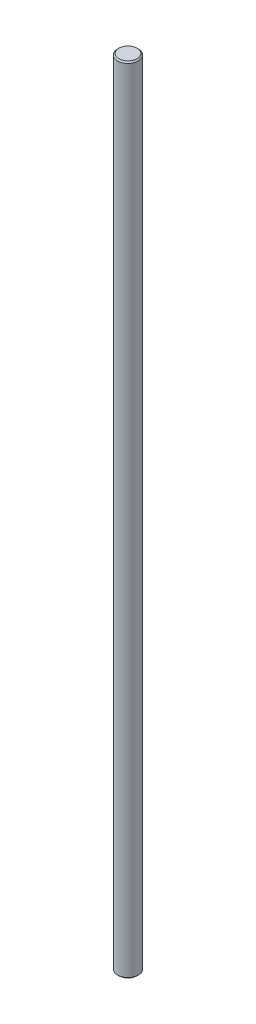
ISO-10303-21;
HEADER;
FILE_DESCRIPTION(('STEP AP214'),'2;1');
FILE_NAME('part.step','',(''),(''),'','','');
FILE_SCHEMA(('AUTOMOTIVE_DESIGN { 1 0 10303 214 1 1 1 1 }'));
ENDSEC;
DATA;
#1=APPLICATION_CONTEXT('core data for automotive mechanical design processes');
#2=APPLICATION_PROTOCOL_DEFINITION('international standard','automotive_design',2000,#1);
#3=PRODUCT_CONTEXT('',#1,'mechanical');
#4=PRODUCT('Part','Part','',(#3));
#5=PRODUCT_RELATED_PRODUCT_CATEGORY('part','',(#4));
#6=PRODUCT_DEFINITION_FORMATION('','',#4);
#7=PRODUCT_DEFINITION_CONTEXT('part definition',#1,'design');
#8=PRODUCT_DEFINITION('design','',#6,#7);
#9=PRODUCT_DEFINITION_SHAPE('','',#8);
#10=(LENGTH_UNIT() NAMED_UNIT(*) SI_UNIT(.MILLI.,.METRE.));
#11=(NAMED_UNIT(*) PLANE_ANGLE_UNIT() SI_UNIT($,.RADIAN.));
#12=(NAMED_UNIT(*) SI_UNIT($,.STERADIAN.) SOLID_ANGLE_UNIT());
#13=UNCERTAINTY_MEASURE_WITH_UNIT(LENGTH_MEASURE(1.E-05),#10,'distance_accuracy_value','');
#14=(GEOMETRIC_REPRESENTATION_CONTEXT(3) GLOBAL_UNCERTAINTY_ASSIGNED_CONTEXT((#13)) GLOBAL_UNIT_ASSIGNED_CONTEXT((#10,
#11,#12)) REPRESENTATION_CONTEXT('',''));
#15=CARTESIAN_POINT('',(0.,0.,0.));
#16=DIRECTION('',(0.,0.,1.));
#17=DIRECTION('',(1.,0.,0.));
#18=AXIS2_PLACEMENT_3D('',#15,#16,#17);
#19=CARTESIAN_POINT('',(0.,0.,0.));
#20=DIRECTION('',(0.,1.,0.));
#21=DIRECTION('',(1.,0.,0.));
#22=AXIS2_PLACEMENT_3D('',#19,#20,#21);
#23=PLANE('',#22);
#24=CARTESIAN_POINT('',(0.,0.,0.));
#25=DIRECTION('',(0.,-1.,0.));
#26=DIRECTION('',(1.,0.,0.));
#27=AXIS2_PLACEMENT_3D('',#24,#25,#26);
#28=CIRCLE('',#27,3.5);
#29=CARTESIAN_POINT('',(3.5,0.,0.));
#30=VERTEX_POINT('',#29);
#31=EDGE_CURVE('E10',#30,#30,#28,.T.);
#32=ORIENTED_EDGE('',*,*,#31,.T.);
#33=EDGE_LOOP('',(#32));
#34=FACE_BOUND('',#33,.T.);
#35=ADVANCED_FACE('F15',(#34),#23,.F.);
#36=CARTESIAN_POINT('',(0.,0.2499999789677,0.));
#37=DIRECTION('',(0.,1.,0.));
#38=DIRECTION('',(0.,0.,-1.));
#39=AXIS2_PLACEMENT_3D('',#36,#37,#38);
#40=CONICAL_SURFACE('',#39,3.749999978968,0.7853981633973);
#41=CARTESIAN_POINT('',(0.,0.5,0.));
#42=DIRECTION('',(0.,-1.,0.));
#43=DIRECTION('',(-1.,0.,0.));
#44=AXIS2_PLACEMENT_3D('',#41,#42,#43);
#45=CIRCLE('',#44,4.);
#46=CARTESIAN_POINT('',(-4.,0.5,0.));
#47=VERTEX_POINT('',#46);
#48=EDGE_CURVE('E23',#47,#47,#45,.T.);
#49=ORIENTED_EDGE('',*,*,#48,.T.);
#50=EDGE_LOOP('',(#49));
#51=FACE_BOUND('',#50,.T.);
#52=ORIENTED_EDGE('',*,*,#31,.F.);
#53=EDGE_LOOP('',(#52));
#54=FACE_BOUND('',#53,.T.);
#55=ADVANCED_FACE('F45',(#51,#54),#40,.T.);
#56=CARTESIAN_POINT('',(0.,0.,0.));
#57=DIRECTION('',(0.,1.,0.));
#58=DIRECTION('',(1.,0.,0.));
#59=AXIS2_PLACEMENT_3D('',#56,#57,#58);
#60=CYLINDRICAL_SURFACE('',#59,4.);
#61=CARTESIAN_POINT('',(0.,304.5,0.));
#62=DIRECTION('',(0.,1.,0.));
#63=DIRECTION('',(-1.,0.,0.));
#64=AXIS2_PLACEMENT_3D('',#61,#62,#63);
#65=CIRCLE('',#64,4.);
#66=CARTESIAN_POINT('',(-4.,304.5,0.));
#67=VERTEX_POINT('',#66);
#68=EDGE_CURVE('E28',#67,#67,#65,.T.);
#69=ORIENTED_EDGE('',*,*,#68,.F.);
#70=EDGE_LOOP('',(#69));
#71=FACE_BOUND('',#70,.T.);
#72=ORIENTED_EDGE('',*,*,#48,.F.);
#73=EDGE_LOOP('',(#72));
#74=FACE_BOUND('',#73,.T.);
#75=ADVANCED_FACE('F39',(#71,#74),#60,.T.);
#76=CARTESIAN_POINT('',(0.,304.750000021,0.));
#77=DIRECTION('',(0.,-1.,0.));
#78=DIRECTION('',(0.,0.,-1.));
#79=AXIS2_PLACEMENT_3D('',#76,#77,#78);
#80=CONICAL_SURFACE('',#79,3.749999978968,0.7853981633973);
#81=ORIENTED_EDGE('',*,*,#68,.T.);
#82=EDGE_LOOP('',(#81));
#83=FACE_BOUND('',#82,.T.);
#84=CARTESIAN_POINT('',(0.,305.,0.));
#85=DIRECTION('',(0.,1.,0.));
#86=DIRECTION('',(-1.,0.,0.));
#87=AXIS2_PLACEMENT_3D('',#84,#85,#86);
#88=CIRCLE('',#87,3.5);
#89=CARTESIAN_POINT('',(-3.5,305.,0.));
#90=VERTEX_POINT('',#89);
#91=EDGE_CURVE('E19',#90,#90,#88,.T.);
#92=ORIENTED_EDGE('',*,*,#91,.F.);
#93=EDGE_LOOP('',(#92));
#94=FACE_BOUND('',#93,.T.);
#95=ADVANCED_FACE('F37',(#83,#94),#80,.T.);
#96=CARTESIAN_POINT('',(0.,305.,0.));
#97=DIRECTION('',(0.,1.,0.));
#98=DIRECTION('',(1.,0.,0.));
#99=AXIS2_PLACEMENT_3D('',#96,#97,#98);
#100=PLANE('',#99);
#101=ORIENTED_EDGE('',*,*,#91,.T.);
#102=EDGE_LOOP('',(#101));
#103=FACE_BOUND('',#102,.T.);
#104=ADVANCED_FACE('F17',(#103),#100,.T.);
#105=CLOSED_SHELL('',(#35,#55,#75,#95,#104));
#106=MANIFOLD_SOLID_BREP('B1',#105);
#107=ADVANCED_BREP_SHAPE_REPRESENTATION('',(#18,#106),#14);
#108=SHAPE_DEFINITION_REPRESENTATION(#9,#107);
ENDSEC;
END-ISO-10303-21;
